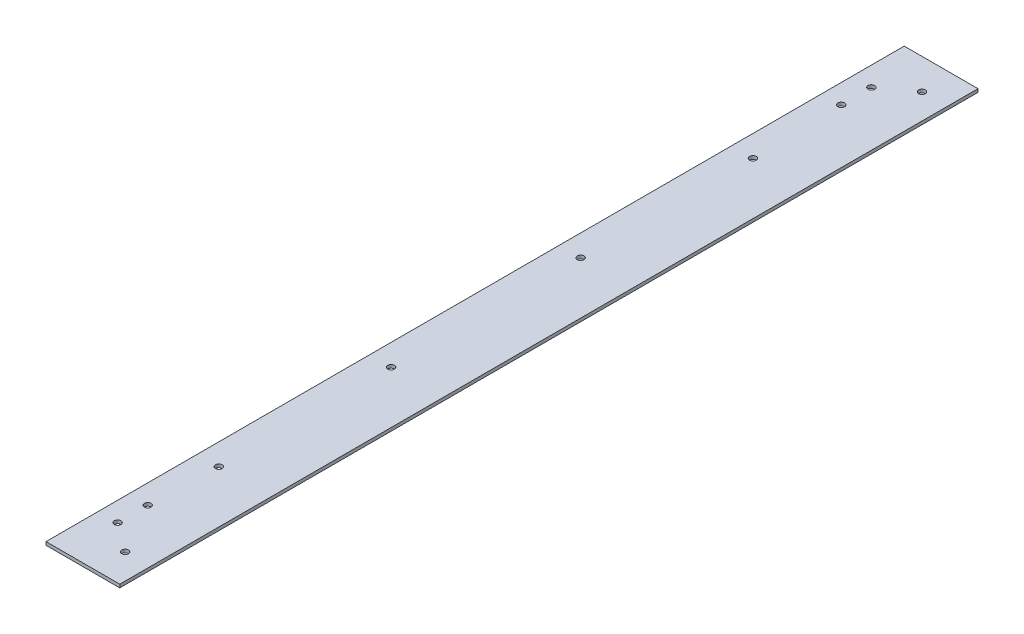
ISO-10303-21;
HEADER;
FILE_DESCRIPTION(('STEP AP214'),'2;1');
FILE_NAME('part.step','',(''),(''),'','','');
FILE_SCHEMA(('AUTOMOTIVE_DESIGN { 1 0 10303 214 1 1 1 1 }'));
ENDSEC;
DATA;
#1=APPLICATION_CONTEXT('core data for automotive mechanical design processes');
#2=APPLICATION_PROTOCOL_DEFINITION('international standard','automotive_design',2000,#1);
#3=PRODUCT_CONTEXT('',#1,'mechanical');
#4=PRODUCT('Part','Part','',(#3));
#5=PRODUCT_RELATED_PRODUCT_CATEGORY('part','',(#4));
#6=PRODUCT_DEFINITION_FORMATION('','',#4);
#7=PRODUCT_DEFINITION_CONTEXT('part definition',#1,'design');
#8=PRODUCT_DEFINITION('design','',#6,#7);
#9=PRODUCT_DEFINITION_SHAPE('','',#8);
#10=(LENGTH_UNIT() NAMED_UNIT(*) SI_UNIT(.MILLI.,.METRE.));
#11=(NAMED_UNIT(*) PLANE_ANGLE_UNIT() SI_UNIT($,.RADIAN.));
#12=(NAMED_UNIT(*) SI_UNIT($,.STERADIAN.) SOLID_ANGLE_UNIT());
#13=UNCERTAINTY_MEASURE_WITH_UNIT(LENGTH_MEASURE(1.E-05),#10,'distance_accuracy_value','');
#14=(GEOMETRIC_REPRESENTATION_CONTEXT(3) GLOBAL_UNCERTAINTY_ASSIGNED_CONTEXT((#13)) GLOBAL_UNIT_ASSIGNED_CONTEXT((#10,
#11,#12)) REPRESENTATION_CONTEXT('',''));
#15=CARTESIAN_POINT('',(0.,0.,0.));
#16=DIRECTION('',(0.,0.,1.));
#17=DIRECTION('',(1.,0.,0.));
#18=AXIS2_PLACEMENT_3D('',#15,#16,#17);
#19=CARTESIAN_POINT('',(0.,1.5,0.));
#20=DIRECTION('',(0.,1.,0.));
#21=DIRECTION('',(0.,0.,1.));
#22=AXIS2_PLACEMENT_3D('',#19,#20,#21);
#23=PLANE('',#22);
#24=CARTESIAN_POINT('',(22.5,1.5,385.));
#25=DIRECTION('',(0.,1.,0.));
#26=DIRECTION('',(0.,0.,1.));
#27=AXIS2_PLACEMENT_3D('',#24,#25,#26);
#28=CIRCLE('',#27,1.55000000000002);
#29=CARTESIAN_POINT('',(22.5,1.5,386.55));
#30=VERTEX_POINT('',#29);
#31=EDGE_CURVE('E153',#30,#30,#28,.T.);
#32=ORIENTED_EDGE('',*,*,#31,.F.);
#33=EDGE_LOOP('',(#32));
#34=FACE_BOUND('',#33,.T.);
#35=CARTESIAN_POINT('',(22.5,1.5,15.));
#36=DIRECTION('',(0.,1.,0.));
#37=DIRECTION('',(0.,0.,1.));
#38=AXIS2_PLACEMENT_3D('',#35,#36,#37);
#39=CIRCLE('',#38,1.55);
#40=CARTESIAN_POINT('',(22.5,1.5,16.55));
#41=VERTEX_POINT('',#40);
#42=EDGE_CURVE('E45',#41,#41,#39,.T.);
#43=ORIENTED_EDGE('',*,*,#42,.F.);
#44=EDGE_LOOP('',(#43));
#45=FACE_BOUND('',#44,.T.);
#46=CARTESIAN_POINT('',(9.,1.5,375.));
#47=DIRECTION('',(0.,1.,0.));
#48=DIRECTION('',(0.,0.,1.));
#49=AXIS2_PLACEMENT_3D('',#46,#47,#48);
#50=CIRCLE('',#49,1.55000000000003);
#51=CARTESIAN_POINT('',(9.,1.5,376.55));
#52=VERTEX_POINT('',#51);
#53=EDGE_CURVE('E127',#52,#52,#50,.T.);
#54=ORIENTED_EDGE('',*,*,#53,.F.);
#55=EDGE_LOOP('',(#54));
#56=FACE_BOUND('',#55,.T.);
#57=CARTESIAN_POINT('',(9.,1.5,361.));
#58=DIRECTION('',(0.,1.,0.));
#59=DIRECTION('',(0.,0.,1.));
#60=AXIS2_PLACEMENT_3D('',#57,#58,#59);
#61=CIRCLE('',#60,1.55000000000003);
#62=CARTESIAN_POINT('',(9.,1.5,362.55));
#63=VERTEX_POINT('',#62);
#64=EDGE_CURVE('E162',#63,#63,#61,.T.);
#65=ORIENTED_EDGE('',*,*,#64,.F.);
#66=EDGE_LOOP('',(#65));
#67=FACE_BOUND('',#66,.T.);
#68=CARTESIAN_POINT('',(9.,1.5,39.));
#69=DIRECTION('',(0.,1.,0.));
#70=DIRECTION('',(0.,0.,1.));
#71=AXIS2_PLACEMENT_3D('',#68,#69,#70);
#72=CIRCLE('',#71,1.55);
#73=CARTESIAN_POINT('',(9.,1.5,40.55));
#74=VERTEX_POINT('',#73);
#75=EDGE_CURVE('E154',#74,#74,#72,.T.);
#76=ORIENTED_EDGE('',*,*,#75,.F.);
#77=EDGE_LOOP('',(#76));
#78=FACE_BOUND('',#77,.T.);
#79=CARTESIAN_POINT('',(9.,1.5,25.));
#80=DIRECTION('',(0.,1.,0.));
#81=DIRECTION('',(0.,0.,1.));
#82=AXIS2_PLACEMENT_3D('',#79,#80,#81);
#83=CIRCLE('',#82,1.55);
#84=CARTESIAN_POINT('',(9.,1.5,26.55));
#85=VERTEX_POINT('',#84);
#86=EDGE_CURVE('E144',#85,#85,#83,.T.);
#87=ORIENTED_EDGE('',*,*,#86,.F.);
#88=EDGE_LOOP('',(#87));
#89=FACE_BOUND('',#88,.T.);
#90=CARTESIAN_POINT('',(10.,1.5,329.));
#91=DIRECTION('',(0.,1.,0.));
#92=DIRECTION('',(0.,0.,1.));
#93=AXIS2_PLACEMENT_3D('',#90,#91,#92);
#94=CIRCLE('',#93,1.55000000000002);
#95=CARTESIAN_POINT('',(10.,1.5,330.55));
#96=VERTEX_POINT('',#95);
#97=EDGE_CURVE('E109',#96,#96,#94,.T.);
#98=ORIENTED_EDGE('',*,*,#97,.F.);
#99=EDGE_LOOP('',(#98));
#100=FACE_BOUND('',#99,.T.);
#101=CARTESIAN_POINT('',(10.,1.5,249.));
#102=DIRECTION('',(0.,1.,0.));
#103=DIRECTION('',(0.,0.,1.));
#104=AXIS2_PLACEMENT_3D('',#101,#102,#103);
#105=CIRCLE('',#104,1.55);
#106=CARTESIAN_POINT('',(10.,1.5,250.55));
#107=VERTEX_POINT('',#106);
#108=EDGE_CURVE('E134',#107,#107,#105,.T.);
#109=ORIENTED_EDGE('',*,*,#108,.F.);
#110=EDGE_LOOP('',(#109));
#111=FACE_BOUND('',#110,.T.);
#112=CARTESIAN_POINT('',(10.,1.5,161.));
#113=DIRECTION('',(0.,1.,0.));
#114=DIRECTION('',(0.,0.,1.));
#115=AXIS2_PLACEMENT_3D('',#112,#113,#114);
#116=CIRCLE('',#115,1.54999999999999);
#117=CARTESIAN_POINT('',(10.,1.5,162.55));
#118=VERTEX_POINT('',#117);
#119=EDGE_CURVE('E128',#118,#118,#116,.T.);
#120=ORIENTED_EDGE('',*,*,#119,.F.);
#121=EDGE_LOOP('',(#120));
#122=FACE_BOUND('',#121,.T.);
#123=CARTESIAN_POINT('',(10.,1.5,81.));
#124=DIRECTION('',(0.,1.,0.));
#125=DIRECTION('',(0.,0.,1.));
#126=AXIS2_PLACEMENT_3D('',#123,#124,#125);
#127=CIRCLE('',#126,1.54999999999999);
#128=CARTESIAN_POINT('',(10.,1.5,82.55));
#129=VERTEX_POINT('',#128);
#130=EDGE_CURVE('E120',#129,#129,#127,.T.);
#131=ORIENTED_EDGE('',*,*,#130,.F.);
#132=EDGE_LOOP('',(#131));
#133=FACE_BOUND('',#132,.T.);
#134=DIRECTION('',(-1.,0.,0.));
#135=VECTOR('',#134,1.);
#136=CARTESIAN_POINT('',(34.25,1.5,0.75));
#137=LINE('',#136,#135);
#138=CARTESIAN_POINT('',(34.25,1.5,0.75));
#139=VERTEX_POINT('',#138);
#140=CARTESIAN_POINT('',(0.,1.5,0.75));
#141=VERTEX_POINT('',#140);
#142=EDGE_CURVE('E79',#139,#141,#137,.T.);
#143=ORIENTED_EDGE('',*,*,#142,.T.);
#144=DIRECTION('',(0.,0.,1.));
#145=VECTOR('',#144,1.);
#146=CARTESIAN_POINT('',(0.,1.5,0.75));
#147=LINE('',#146,#145);
#148=CARTESIAN_POINT('',(0.,1.5,399.25));
#149=VERTEX_POINT('',#148);
#150=EDGE_CURVE('E83',#141,#149,#147,.T.);
#151=ORIENTED_EDGE('',*,*,#150,.T.);
#152=DIRECTION('',(1.,0.,0.));
#153=VECTOR('',#152,1.);
#154=CARTESIAN_POINT('',(0.750000000000049,1.5,399.25));
#155=LINE('',#154,#153);
#156=CARTESIAN_POINT('',(34.25,1.5,399.25));
#157=VERTEX_POINT('',#156);
#158=EDGE_CURVE('E86',#149,#157,#155,.T.);
#159=ORIENTED_EDGE('',*,*,#158,.T.);
#160=DIRECTION('',(0.,0.,-1.));
#161=VECTOR('',#160,1.);
#162=CARTESIAN_POINT('',(34.25,1.5,399.25));
#163=LINE('',#162,#161);
#164=EDGE_CURVE('E85',#157,#139,#163,.T.);
#165=ORIENTED_EDGE('',*,*,#164,.T.);
#166=EDGE_LOOP('',(#143,#151,#159,#165));
#167=FACE_BOUND('',#166,.T.);
#168=ADVANCED_FACE('F36',(#34,#45,#56,#67,#78,#89,#100,#111,#122,#133,#167),#23,.T.);
#169=CARTESIAN_POINT('',(0.,0.,0.));
#170=DIRECTION('',(0.,1.,0.));
#171=DIRECTION('',(0.,0.,1.));
#172=AXIS2_PLACEMENT_3D('',#169,#170,#171);
#173=PLANE('',#172);
#174=CARTESIAN_POINT('',(22.5,0.,385.));
#175=DIRECTION('',(0.,1.,0.));
#176=DIRECTION('',(0.,0.,1.));
#177=AXIS2_PLACEMENT_3D('',#174,#175,#176);
#178=CIRCLE('',#177,1.55000000000002);
#179=CARTESIAN_POINT('',(22.5,0.,386.55));
#180=VERTEX_POINT('',#179);
#181=EDGE_CURVE('E40',#180,#180,#178,.F.);
#182=ORIENTED_EDGE('',*,*,#181,.F.);
#183=EDGE_LOOP('',(#182));
#184=FACE_BOUND('',#183,.T.);
#185=CARTESIAN_POINT('',(22.5,0.,15.));
#186=DIRECTION('',(0.,1.,0.));
#187=DIRECTION('',(0.,0.,1.));
#188=AXIS2_PLACEMENT_3D('',#185,#186,#187);
#189=CIRCLE('',#188,1.55);
#190=CARTESIAN_POINT('',(22.5,0.,16.55));
#191=VERTEX_POINT('',#190);
#192=EDGE_CURVE('E12',#191,#191,#189,.F.);
#193=ORIENTED_EDGE('',*,*,#192,.F.);
#194=EDGE_LOOP('',(#193));
#195=FACE_BOUND('',#194,.T.);
#196=CARTESIAN_POINT('',(9.,0.,375.));
#197=DIRECTION('',(0.,1.,0.));
#198=DIRECTION('',(0.,0.,1.));
#199=AXIS2_PLACEMENT_3D('',#196,#197,#198);
#200=CIRCLE('',#199,1.55000000000003);
#201=CARTESIAN_POINT('',(9.,0.,376.55));
#202=VERTEX_POINT('',#201);
#203=EDGE_CURVE('E165',#202,#202,#200,.F.);
#204=ORIENTED_EDGE('',*,*,#203,.F.);
#205=EDGE_LOOP('',(#204));
#206=FACE_BOUND('',#205,.T.);
#207=CARTESIAN_POINT('',(9.,0.,361.));
#208=DIRECTION('',(0.,1.,0.));
#209=DIRECTION('',(0.,0.,1.));
#210=AXIS2_PLACEMENT_3D('',#207,#208,#209);
#211=CIRCLE('',#210,1.55000000000003);
#212=CARTESIAN_POINT('',(9.,0.,362.55));
#213=VERTEX_POINT('',#212);
#214=EDGE_CURVE('E158',#213,#213,#211,.F.);
#215=ORIENTED_EDGE('',*,*,#214,.F.);
#216=EDGE_LOOP('',(#215));
#217=FACE_BOUND('',#216,.T.);
#218=CARTESIAN_POINT('',(9.,0.,39.));
#219=DIRECTION('',(0.,1.,0.));
#220=DIRECTION('',(0.,0.,1.));
#221=AXIS2_PLACEMENT_3D('',#218,#219,#220);
#222=CIRCLE('',#221,1.55);
#223=CARTESIAN_POINT('',(9.,0.,40.55));
#224=VERTEX_POINT('',#223);
#225=EDGE_CURVE('E149',#224,#224,#222,.F.);
#226=ORIENTED_EDGE('',*,*,#225,.F.);
#227=EDGE_LOOP('',(#226));
#228=FACE_BOUND('',#227,.T.);
#229=CARTESIAN_POINT('',(9.,0.,25.));
#230=DIRECTION('',(0.,1.,0.));
#231=DIRECTION('',(0.,0.,1.));
#232=AXIS2_PLACEMENT_3D('',#229,#230,#231);
#233=CIRCLE('',#232,1.55);
#234=CARTESIAN_POINT('',(9.,0.,26.55));
#235=VERTEX_POINT('',#234);
#236=EDGE_CURVE('E148',#235,#235,#233,.F.);
#237=ORIENTED_EDGE('',*,*,#236,.F.);
#238=EDGE_LOOP('',(#237));
#239=FACE_BOUND('',#238,.T.);
#240=CARTESIAN_POINT('',(10.,0.,329.));
#241=DIRECTION('',(0.,1.,0.));
#242=DIRECTION('',(0.,0.,1.));
#243=AXIS2_PLACEMENT_3D('',#240,#241,#242);
#244=CIRCLE('',#243,1.55000000000002);
#245=CARTESIAN_POINT('',(10.,0.,330.55));
#246=VERTEX_POINT('',#245);
#247=EDGE_CURVE('E137',#246,#246,#244,.F.);
#248=ORIENTED_EDGE('',*,*,#247,.F.);
#249=EDGE_LOOP('',(#248));
#250=FACE_BOUND('',#249,.T.);
#251=CARTESIAN_POINT('',(10.,0.,249.));
#252=DIRECTION('',(0.,1.,0.));
#253=DIRECTION('',(0.,0.,1.));
#254=AXIS2_PLACEMENT_3D('',#251,#252,#253);
#255=CIRCLE('',#254,1.55);
#256=CARTESIAN_POINT('',(10.,0.,250.55));
#257=VERTEX_POINT('',#256);
#258=EDGE_CURVE('E131',#257,#257,#255,.F.);
#259=ORIENTED_EDGE('',*,*,#258,.F.);
#260=EDGE_LOOP('',(#259));
#261=FACE_BOUND('',#260,.T.);
#262=CARTESIAN_POINT('',(10.,0.,161.));
#263=DIRECTION('',(0.,1.,0.));
#264=DIRECTION('',(0.,0.,1.));
#265=AXIS2_PLACEMENT_3D('',#262,#263,#264);
#266=CIRCLE('',#265,1.54999999999999);
#267=CARTESIAN_POINT('',(10.,0.,162.55));
#268=VERTEX_POINT('',#267);
#269=EDGE_CURVE('E124',#268,#268,#266,.F.);
#270=ORIENTED_EDGE('',*,*,#269,.F.);
#271=EDGE_LOOP('',(#270));
#272=FACE_BOUND('',#271,.T.);
#273=CARTESIAN_POINT('',(10.,0.,81.));
#274=DIRECTION('',(0.,1.,0.));
#275=DIRECTION('',(0.,0.,1.));
#276=AXIS2_PLACEMENT_3D('',#273,#274,#275);
#277=CIRCLE('',#276,1.54999999999999);
#278=CARTESIAN_POINT('',(10.,0.,82.55));
#279=VERTEX_POINT('',#278);
#280=EDGE_CURVE('E123',#279,#279,#277,.F.);
#281=ORIENTED_EDGE('',*,*,#280,.F.);
#282=EDGE_LOOP('',(#281));
#283=FACE_BOUND('',#282,.T.);
#284=DIRECTION('',(-1.,0.,0.));
#285=VECTOR('',#284,1.);
#286=CARTESIAN_POINT('',(0.750000000000049,0.,399.25));
#287=LINE('',#286,#285);
#288=CARTESIAN_POINT('',(34.25,0.,399.25));
#289=VERTEX_POINT('',#288);
#290=CARTESIAN_POINT('',(0.,0.,399.25));
#291=VERTEX_POINT('',#290);
#292=EDGE_CURVE('E61',#289,#291,#287,.T.);
#293=ORIENTED_EDGE('',*,*,#292,.T.);
#294=DIRECTION('',(0.,0.,-1.));
#295=VECTOR('',#294,1.);
#296=CARTESIAN_POINT('',(0.,0.,0.75));
#297=LINE('',#296,#295);
#298=CARTESIAN_POINT('',(0.,-1.11022302462516E-13,0.75));
#299=VERTEX_POINT('',#298);
#300=EDGE_CURVE('E87',#291,#299,#297,.T.);
#301=ORIENTED_EDGE('',*,*,#300,.T.);
#302=DIRECTION('',(1.,0.,0.));
#303=VECTOR('',#302,1.);
#304=CARTESIAN_POINT('',(34.25,0.,0.75));
#305=LINE('',#304,#303);
#306=CARTESIAN_POINT('',(34.25,0.,0.75));
#307=VERTEX_POINT('',#306);
#308=EDGE_CURVE('E93',#299,#307,#305,.T.);
#309=ORIENTED_EDGE('',*,*,#308,.T.);
#310=DIRECTION('',(0.,0.,1.));
#311=VECTOR('',#310,1.);
#312=CARTESIAN_POINT('',(34.25,0.,399.25));
#313=LINE('',#312,#311);
#314=EDGE_CURVE('E110',#307,#289,#313,.T.);
#315=ORIENTED_EDGE('',*,*,#314,.T.);
#316=EDGE_LOOP('',(#293,#301,#309,#315));
#317=FACE_BOUND('',#316,.T.);
#318=ADVANCED_FACE('F38',(#184,#195,#206,#217,#228,#239,#250,#261,#272,#283,#317),#173,.F.);
#319=CARTESIAN_POINT('',(22.5,-4.38406204335661,385.));
#320=DIRECTION('',(0.,1.,0.));
#321=DIRECTION('',(0.,0.,1.));
#322=AXIS2_PLACEMENT_3D('',#319,#320,#321);
#323=CYLINDRICAL_SURFACE('',#322,1.55000000000002);
#324=ORIENTED_EDGE('',*,*,#181,.T.);
#325=EDGE_LOOP('',(#324));
#326=FACE_BOUND('',#325,.T.);
#327=ORIENTED_EDGE('',*,*,#31,.T.);
#328=EDGE_LOOP('',(#327));
#329=FACE_BOUND('',#328,.T.);
#330=ADVANCED_FACE('F179',(#326,#329),#323,.F.);
#331=CARTESIAN_POINT('',(22.5,-4.38406204335661,15.));
#332=DIRECTION('',(0.,1.,0.));
#333=DIRECTION('',(0.,0.,1.));
#334=AXIS2_PLACEMENT_3D('',#331,#332,#333);
#335=CYLINDRICAL_SURFACE('',#334,1.55);
#336=ORIENTED_EDGE('',*,*,#192,.T.);
#337=EDGE_LOOP('',(#336));
#338=FACE_BOUND('',#337,.T.);
#339=ORIENTED_EDGE('',*,*,#42,.T.);
#340=EDGE_LOOP('',(#339));
#341=FACE_BOUND('',#340,.T.);
#342=ADVANCED_FACE('F223',(#338,#341),#335,.F.);
#343=CARTESIAN_POINT('',(9.,-4.38406204335671,375.));
#344=DIRECTION('',(0.,1.,0.));
#345=DIRECTION('',(0.,0.,1.));
#346=AXIS2_PLACEMENT_3D('',#343,#344,#345);
#347=CYLINDRICAL_SURFACE('',#346,1.55000000000003);
#348=ORIENTED_EDGE('',*,*,#203,.T.);
#349=EDGE_LOOP('',(#348));
#350=FACE_BOUND('',#349,.T.);
#351=ORIENTED_EDGE('',*,*,#53,.T.);
#352=EDGE_LOOP('',(#351));
#353=FACE_BOUND('',#352,.T.);
#354=ADVANCED_FACE('F226',(#350,#353),#347,.F.);
#355=CARTESIAN_POINT('',(9.,-4.38406204335671,361.));
#356=DIRECTION('',(0.,1.,0.));
#357=DIRECTION('',(0.,0.,1.));
#358=AXIS2_PLACEMENT_3D('',#355,#356,#357);
#359=CYLINDRICAL_SURFACE('',#358,1.55000000000003);
#360=ORIENTED_EDGE('',*,*,#214,.T.);
#361=EDGE_LOOP('',(#360));
#362=FACE_BOUND('',#361,.T.);
#363=ORIENTED_EDGE('',*,*,#64,.T.);
#364=EDGE_LOOP('',(#363));
#365=FACE_BOUND('',#364,.T.);
#366=ADVANCED_FACE('F230',(#362,#365),#359,.F.);
#367=CARTESIAN_POINT('',(9.,-4.38406204335671,39.));
#368=DIRECTION('',(0.,1.,0.));
#369=DIRECTION('',(0.,0.,1.));
#370=AXIS2_PLACEMENT_3D('',#367,#368,#369);
#371=CYLINDRICAL_SURFACE('',#370,1.55);
#372=ORIENTED_EDGE('',*,*,#225,.T.);
#373=EDGE_LOOP('',(#372));
#374=FACE_BOUND('',#373,.T.);
#375=ORIENTED_EDGE('',*,*,#75,.T.);
#376=EDGE_LOOP('',(#375));
#377=FACE_BOUND('',#376,.T.);
#378=ADVANCED_FACE('F234',(#374,#377),#371,.F.);
#379=CARTESIAN_POINT('',(9.,-4.38406204335671,25.));
#380=DIRECTION('',(0.,1.,0.));
#381=DIRECTION('',(0.,0.,1.));
#382=AXIS2_PLACEMENT_3D('',#379,#380,#381);
#383=CYLINDRICAL_SURFACE('',#382,1.55);
#384=ORIENTED_EDGE('',*,*,#236,.T.);
#385=EDGE_LOOP('',(#384));
#386=FACE_BOUND('',#385,.T.);
#387=ORIENTED_EDGE('',*,*,#86,.T.);
#388=EDGE_LOOP('',(#387));
#389=FACE_BOUND('',#388,.T.);
#390=ADVANCED_FACE('F238',(#386,#389),#383,.F.);
#391=CARTESIAN_POINT('',(10.,-4.38406204335662,329.));
#392=DIRECTION('',(0.,1.,0.));
#393=DIRECTION('',(0.,0.,1.));
#394=AXIS2_PLACEMENT_3D('',#391,#392,#393);
#395=CYLINDRICAL_SURFACE('',#394,1.55000000000002);
#396=ORIENTED_EDGE('',*,*,#247,.T.);
#397=EDGE_LOOP('',(#396));
#398=FACE_BOUND('',#397,.T.);
#399=ORIENTED_EDGE('',*,*,#97,.T.);
#400=EDGE_LOOP('',(#399));
#401=FACE_BOUND('',#400,.T.);
#402=ADVANCED_FACE('F242',(#398,#401),#395,.F.);
#403=CARTESIAN_POINT('',(10.,-4.38406204335662,249.));
#404=DIRECTION('',(0.,1.,0.));
#405=DIRECTION('',(0.,0.,1.));
#406=AXIS2_PLACEMENT_3D('',#403,#404,#405);
#407=CYLINDRICAL_SURFACE('',#406,1.55);
#408=ORIENTED_EDGE('',*,*,#258,.T.);
#409=EDGE_LOOP('',(#408));
#410=FACE_BOUND('',#409,.T.);
#411=ORIENTED_EDGE('',*,*,#108,.T.);
#412=EDGE_LOOP('',(#411));
#413=FACE_BOUND('',#412,.T.);
#414=ADVANCED_FACE('F246',(#410,#413),#407,.F.);
#415=CARTESIAN_POINT('',(10.,-4.38406204335662,161.));
#416=DIRECTION('',(0.,1.,0.));
#417=DIRECTION('',(0.,0.,1.));
#418=AXIS2_PLACEMENT_3D('',#415,#416,#417);
#419=CYLINDRICAL_SURFACE('',#418,1.54999999999999);
#420=ORIENTED_EDGE('',*,*,#269,.T.);
#421=EDGE_LOOP('',(#420));
#422=FACE_BOUND('',#421,.T.);
#423=ORIENTED_EDGE('',*,*,#119,.T.);
#424=EDGE_LOOP('',(#423));
#425=FACE_BOUND('',#424,.T.);
#426=ADVANCED_FACE('F250',(#422,#425),#419,.F.);
#427=CARTESIAN_POINT('',(10.,-4.38406204335662,81.));
#428=DIRECTION('',(0.,1.,0.));
#429=DIRECTION('',(0.,0.,1.));
#430=AXIS2_PLACEMENT_3D('',#427,#428,#429);
#431=CYLINDRICAL_SURFACE('',#430,1.54999999999999);
#432=ORIENTED_EDGE('',*,*,#280,.T.);
#433=EDGE_LOOP('',(#432));
#434=FACE_BOUND('',#433,.T.);
#435=ORIENTED_EDGE('',*,*,#130,.T.);
#436=EDGE_LOOP('',(#435));
#437=FACE_BOUND('',#436,.T.);
#438=ADVANCED_FACE('F213',(#434,#437),#431,.F.);
#439=CARTESIAN_POINT('',(0.750000000000049,-405.54361356086,399.25));
#440=DIRECTION('',(0.,0.,1.));
#441=DIRECTION('',(1.,0.,0.));
#442=AXIS2_PLACEMENT_3D('',#439,#440,#441);
#443=PLANE('',#442);
#444=DIRECTION('',(0.,1.,0.));
#445=VECTOR('',#444,1.);
#446=CARTESIAN_POINT('',(34.25,-405.54361356086,399.25));
#447=LINE('',#446,#445);
#448=EDGE_CURVE('E117',#289,#157,#447,.T.);
#449=ORIENTED_EDGE('',*,*,#448,.T.);
#450=ORIENTED_EDGE('',*,*,#158,.F.);
#451=DIRECTION('',(0.,1.,0.));
#452=VECTOR('',#451,1.);
#453=CARTESIAN_POINT('',(0.,-398.500705771019,399.25));
#454=LINE('',#453,#452);
#455=EDGE_CURVE('E97',#291,#149,#454,.T.);
#456=ORIENTED_EDGE('',*,*,#455,.F.);
#457=ORIENTED_EDGE('',*,*,#292,.F.);
#458=EDGE_LOOP('',(#449,#450,#456,#457));
#459=FACE_BOUND('',#458,.T.);
#460=ADVANCED_FACE('F201',(#459),#443,.T.);
#461=CARTESIAN_POINT('',(34.25,-405.54361356086,399.25));
#462=DIRECTION('',(1.,0.,0.));
#463=DIRECTION('',(0.,0.,-1.));
#464=AXIS2_PLACEMENT_3D('',#461,#462,#463);
#465=PLANE('',#464);
#466=DIRECTION('',(0.,1.,0.));
#467=VECTOR('',#466,1.);
#468=CARTESIAN_POINT('',(34.25,-405.54361356086,0.75));
#469=LINE('',#468,#467);
#470=EDGE_CURVE('E53',#307,#139,#469,.T.);
#471=ORIENTED_EDGE('',*,*,#470,.T.);
#472=ORIENTED_EDGE('',*,*,#164,.F.);
#473=ORIENTED_EDGE('',*,*,#448,.F.);
#474=ORIENTED_EDGE('',*,*,#314,.F.);
#475=EDGE_LOOP('',(#471,#472,#473,#474));
#476=FACE_BOUND('',#475,.T.);
#477=ADVANCED_FACE('F203',(#476),#465,.T.);
#478=CARTESIAN_POINT('',(34.25,-405.54361356086,0.75));
#479=DIRECTION('',(0.,0.,-1.));
#480=DIRECTION('',(-1.,0.,0.));
#481=AXIS2_PLACEMENT_3D('',#478,#479,#480);
#482=PLANE('',#481);
#483=ORIENTED_EDGE('',*,*,#308,.F.);
#484=DIRECTION('',(0.,1.,0.));
#485=VECTOR('',#484,1.);
#486=CARTESIAN_POINT('',(0.,-398.500705771019,0.75));
#487=LINE('',#486,#485);
#488=EDGE_CURVE('E90',#299,#141,#487,.T.);
#489=ORIENTED_EDGE('',*,*,#488,.T.);
#490=ORIENTED_EDGE('',*,*,#142,.F.);
#491=ORIENTED_EDGE('',*,*,#470,.F.);
#492=EDGE_LOOP('',(#483,#489,#490,#491));
#493=FACE_BOUND('',#492,.T.);
#494=ADVANCED_FACE('F91',(#493),#482,.T.);
#495=CARTESIAN_POINT('',(0.,-398.500705771019,0.75));
#496=DIRECTION('',(-1.,0.,0.));
#497=DIRECTION('',(0.,0.,1.));
#498=AXIS2_PLACEMENT_3D('',#495,#496,#497);
#499=PLANE('',#498);
#500=ORIENTED_EDGE('',*,*,#300,.F.);
#501=ORIENTED_EDGE('',*,*,#455,.T.);
#502=ORIENTED_EDGE('',*,*,#150,.F.);
#503=ORIENTED_EDGE('',*,*,#488,.F.);
#504=EDGE_LOOP('',(#500,#501,#502,#503));
#505=FACE_BOUND('',#504,.T.);
#506=ADVANCED_FACE('F100',(#505),#499,.T.);
#507=CLOSED_SHELL('',(#168,#318,#330,#342,#354,#366,#378,#390,#402,#414,#426,#438,#460,#477,
#494,#506));
#508=MANIFOLD_SOLID_BREP('B2',#507);
#509=ADVANCED_BREP_SHAPE_REPRESENTATION('',(#18,#508),#14);
#510=SHAPE_DEFINITION_REPRESENTATION(#9,#509);
ENDSEC;
END-ISO-10303-21;
